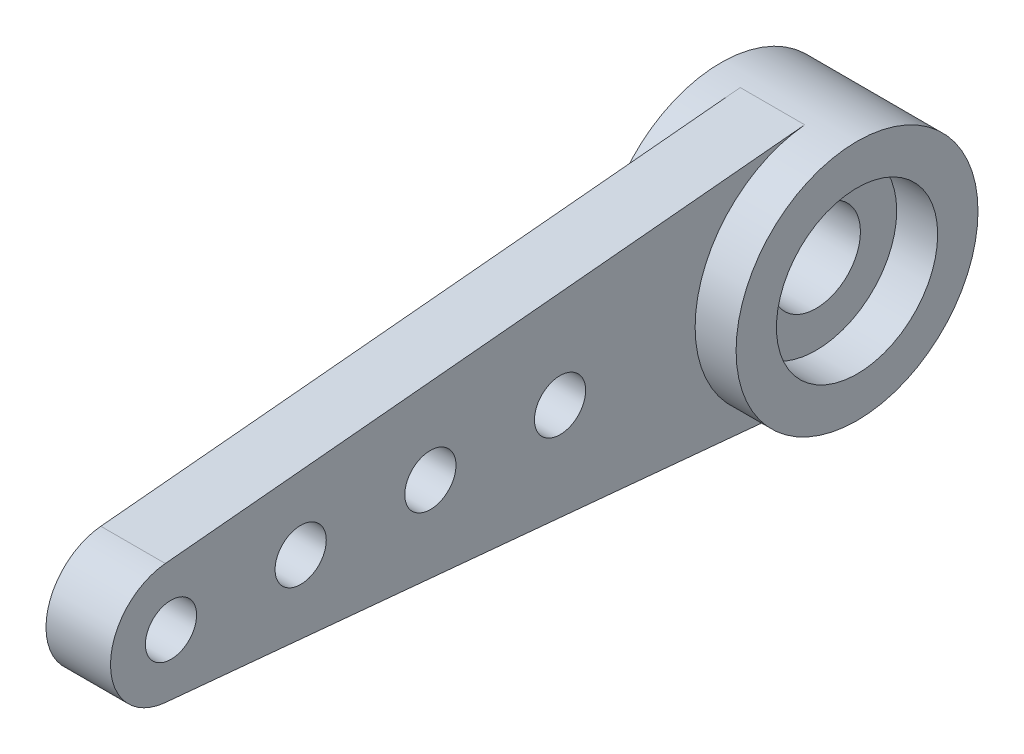
ISO-10303-21;
HEADER;
FILE_DESCRIPTION(('STEP AP214'),'2;1');
FILE_NAME('part.step','',(''),(''),'','','');
FILE_SCHEMA(('AUTOMOTIVE_DESIGN { 1 0 10303 214 1 1 1 1 }'));
ENDSEC;
DATA;
#1=APPLICATION_CONTEXT('core data for automotive mechanical design processes');
#2=APPLICATION_PROTOCOL_DEFINITION('international standard','automotive_design',2000,#1);
#3=PRODUCT_CONTEXT('',#1,'mechanical');
#4=PRODUCT('Part','Part','',(#3));
#5=PRODUCT_RELATED_PRODUCT_CATEGORY('part','',(#4));
#6=PRODUCT_DEFINITION_FORMATION('','',#4);
#7=PRODUCT_DEFINITION_CONTEXT('part definition',#1,'design');
#8=PRODUCT_DEFINITION('design','',#6,#7);
#9=PRODUCT_DEFINITION_SHAPE('','',#8);
#10=(LENGTH_UNIT() NAMED_UNIT(*) SI_UNIT(.MILLI.,.METRE.));
#11=(NAMED_UNIT(*) PLANE_ANGLE_UNIT() SI_UNIT($,.RADIAN.));
#12=(NAMED_UNIT(*) SI_UNIT($,.STERADIAN.) SOLID_ANGLE_UNIT());
#13=UNCERTAINTY_MEASURE_WITH_UNIT(LENGTH_MEASURE(1.E-05),#10,'distance_accuracy_value','');
#14=(GEOMETRIC_REPRESENTATION_CONTEXT(3) GLOBAL_UNCERTAINTY_ASSIGNED_CONTEXT((#13)) GLOBAL_UNIT_ASSIGNED_CONTEXT((#10,
#11,#12)) REPRESENTATION_CONTEXT('',''));
#15=CARTESIAN_POINT('',(0.,0.,0.));
#16=DIRECTION('',(0.,0.,1.));
#17=DIRECTION('',(1.,0.,0.));
#18=AXIS2_PLACEMENT_3D('',#15,#16,#17);
#19=CARTESIAN_POINT('',(0.,0.,0.));
#20=DIRECTION('',(1.,0.,0.));
#21=DIRECTION('',(0.,0.,-1.));
#22=AXIS2_PLACEMENT_3D('',#19,#20,#21);
#23=PLANE('',#22);
#24=CARTESIAN_POINT('',(0.,0.,0.));
#25=DIRECTION('',(1.,0.,0.));
#26=DIRECTION('',(0.,0.,-1.));
#27=AXIS2_PLACEMENT_3D('',#24,#25,#26);
#28=CIRCLE('',#27,1.1);
#29=CARTESIAN_POINT('',(0.,0.,-1.1));
#30=VERTEX_POINT('',#29);
#31=EDGE_CURVE('E259',#30,#30,#28,.T.);
#32=ORIENTED_EDGE('',*,*,#31,.T.);
#33=EDGE_LOOP('',(#32));
#34=FACE_BOUND('',#33,.T.);
#35=CARTESIAN_POINT('',(0.,0.,0.));
#36=DIRECTION('',(-1.,0.,0.));
#37=DIRECTION('',(0.,0.,1.));
#38=AXIS2_PLACEMENT_3D('',#35,#36,#37);
#39=CIRCLE('',#38,2.);
#40=CARTESIAN_POINT('',(0.,0.,-2.));
#41=VERTEX_POINT('',#40);
#42=EDGE_CURVE('E206',#41,#41,#39,.T.);
#43=ORIENTED_EDGE('',*,*,#42,.T.);
#44=EDGE_LOOP('',(#43));
#45=FACE_BOUND('',#44,.T.);
#46=ADVANCED_FACE('F47',(#34,#45),#23,.F.);
#47=CARTESIAN_POINT('',(1.6,0.,0.));
#48=DIRECTION('',(1.,0.,0.));
#49=DIRECTION('',(0.,0.,-1.));
#50=AXIS2_PLACEMENT_3D('',#47,#48,#49);
#51=PLANE('',#50);
#52=CARTESIAN_POINT('',(1.6,0.,0.));
#53=DIRECTION('',(1.,0.,0.));
#54=DIRECTION('',(0.,0.,-1.));
#55=AXIS2_PLACEMENT_3D('',#52,#53,#54);
#56=CIRCLE('',#55,1.1);
#57=CARTESIAN_POINT('',(1.6,0.,-1.1));
#58=VERTEX_POINT('',#57);
#59=EDGE_CURVE('E107',#58,#58,#56,.T.);
#60=ORIENTED_EDGE('',*,*,#59,.F.);
#61=EDGE_LOOP('',(#60));
#62=FACE_BOUND('',#61,.T.);
#63=CARTESIAN_POINT('',(1.6,0.,0.));
#64=DIRECTION('',(1.,0.,0.));
#65=DIRECTION('',(0.,0.,-1.));
#66=AXIS2_PLACEMENT_3D('',#63,#64,#65);
#67=CIRCLE('',#66,2.);
#68=CARTESIAN_POINT('',(1.6,0.,-2.));
#69=VERTEX_POINT('',#68);
#70=EDGE_CURVE('E215',#69,#69,#67,.T.);
#71=ORIENTED_EDGE('',*,*,#70,.T.);
#72=EDGE_LOOP('',(#71));
#73=FACE_BOUND('',#72,.T.);
#74=ADVANCED_FACE('F151',(#62,#73),#51,.T.);
#75=CARTESIAN_POINT('',(1.6,0.,0.));
#76=DIRECTION('',(1.,0.,0.));
#77=DIRECTION('',(0.,0.,-1.));
#78=AXIS2_PLACEMENT_3D('',#75,#76,#77);
#79=CIRCLE('',#78,3.);
#80=CARTESIAN_POINT('',(1.6,2.98678731038887,0.28125));
#81=VERTEX_POINT('',#80);
#82=CARTESIAN_POINT('',(1.6,-2.98678731038887,0.28125));
#83=VERTEX_POINT('',#82);
#84=EDGE_CURVE('E112',#81,#83,#79,.T.);
#85=ORIENTED_EDGE('',*,*,#84,.F.);
#86=DIRECTION('',(0.,-0.09375,0.995595770129625));
#87=VECTOR('',#86,1.);
#88=CARTESIAN_POINT('',(1.6,2.98678731038887,0.28125));
#89=LINE('',#88,#87);
#90=CARTESIAN_POINT('',(1.6,1.49339365519444,16.140625));
#91=VERTEX_POINT('',#90);
#92=EDGE_CURVE('E90',#81,#91,#89,.T.);
#93=ORIENTED_EDGE('',*,*,#92,.T.);
#94=CARTESIAN_POINT('',(1.6,0.,16.));
#95=DIRECTION('',(1.,0.,0.));
#96=DIRECTION('',(0.,0.,1.));
#97=AXIS2_PLACEMENT_3D('',#94,#95,#96);
#98=CIRCLE('',#97,1.5);
#99=CARTESIAN_POINT('',(1.6,-1.49339365519444,16.140625));
#100=VERTEX_POINT('',#99);
#101=EDGE_CURVE('E120',#91,#100,#98,.T.);
#102=ORIENTED_EDGE('',*,*,#101,.T.);
#103=DIRECTION('',(0.,-0.09375,-0.995595770129625));
#104=VECTOR('',#103,1.);
#105=CARTESIAN_POINT('',(1.6,-2.98678731038887,0.28125));
#106=LINE('',#105,#104);
#107=EDGE_CURVE('E66',#100,#83,#106,.T.);
#108=ORIENTED_EDGE('',*,*,#107,.T.);
#109=EDGE_LOOP('',(#85,#93,#102,#108));
#110=FACE_BOUND('',#109,.T.);
#111=CARTESIAN_POINT('',(1.6,0.,9.56666666666667));
#112=DIRECTION('',(1.,0.,0.));
#113=DIRECTION('',(0.,0.,-1.));
#114=AXIS2_PLACEMENT_3D('',#111,#112,#113);
#115=CIRCLE('',#114,0.635);
#116=CARTESIAN_POINT('',(1.6,0.,8.93166666666667));
#117=VERTEX_POINT('',#116);
#118=EDGE_CURVE('E239',#117,#117,#115,.T.);
#119=ORIENTED_EDGE('',*,*,#118,.F.);
#120=EDGE_LOOP('',(#119));
#121=FACE_BOUND('',#120,.T.);
#122=CARTESIAN_POINT('',(1.6,0.,16.));
#123=DIRECTION('',(1.,0.,0.));
#124=DIRECTION('',(0.,0.,-1.));
#125=AXIS2_PLACEMENT_3D('',#122,#123,#124);
#126=CIRCLE('',#125,0.635);
#127=CARTESIAN_POINT('',(1.6,0.,15.365));
#128=VERTEX_POINT('',#127);
#129=EDGE_CURVE('E255',#128,#128,#126,.T.);
#130=ORIENTED_EDGE('',*,*,#129,.F.);
#131=EDGE_LOOP('',(#130));
#132=FACE_BOUND('',#131,.T.);
#133=CARTESIAN_POINT('',(1.6,0.,12.7833333333333));
#134=DIRECTION('',(1.,0.,0.));
#135=DIRECTION('',(0.,0.,-1.));
#136=AXIS2_PLACEMENT_3D('',#133,#134,#135);
#137=CIRCLE('',#136,0.635);
#138=CARTESIAN_POINT('',(1.6,0.,12.1483333333333));
#139=VERTEX_POINT('',#138);
#140=EDGE_CURVE('E247',#139,#139,#137,.T.);
#141=ORIENTED_EDGE('',*,*,#140,.F.);
#142=EDGE_LOOP('',(#141));
#143=FACE_BOUND('',#142,.T.);
#144=CARTESIAN_POINT('',(1.6,0.,6.35));
#145=DIRECTION('',(1.,0.,0.));
#146=DIRECTION('',(0.,0.,-1.));
#147=AXIS2_PLACEMENT_3D('',#144,#145,#146);
#148=CIRCLE('',#147,0.635);
#149=CARTESIAN_POINT('',(1.6,0.,5.715));
#150=VERTEX_POINT('',#149);
#151=EDGE_CURVE('E231',#150,#150,#148,.T.);
#152=ORIENTED_EDGE('',*,*,#151,.F.);
#153=EDGE_LOOP('',(#152));
#154=FACE_BOUND('',#153,.T.);
#155=ADVANCED_FACE('F158',(#110,#121,#132,#143,#154),#51,.T.);
#156=CARTESIAN_POINT('',(0.,0.,0.));
#157=DIRECTION('',(-1.,0.,0.));
#158=DIRECTION('',(0.,0.,1.));
#159=AXIS2_PLACEMENT_3D('',#156,#157,#158);
#160=CIRCLE('',#159,3.);
#161=CARTESIAN_POINT('',(0.,-2.98678731038887,0.28125));
#162=VERTEX_POINT('',#161);
#163=CARTESIAN_POINT('',(0.,2.98678731038887,0.28125));
#164=VERTEX_POINT('',#163);
#165=EDGE_CURVE('E11',#162,#164,#160,.T.);
#166=ORIENTED_EDGE('',*,*,#165,.F.);
#167=DIRECTION('',(0.,-0.09375,-0.995595770129625));
#168=VECTOR('',#167,1.);
#169=CARTESIAN_POINT('',(0.,-2.98678731038887,0.28125));
#170=LINE('',#169,#168);
#171=CARTESIAN_POINT('',(0.,-1.49339365519444,16.140625));
#172=VERTEX_POINT('',#171);
#173=EDGE_CURVE('E123',#172,#162,#170,.T.);
#174=ORIENTED_EDGE('',*,*,#173,.F.);
#175=CARTESIAN_POINT('',(0.,0.,16.));
#176=DIRECTION('',(1.,0.,0.));
#177=DIRECTION('',(0.,0.,1.));
#178=AXIS2_PLACEMENT_3D('',#175,#176,#177);
#179=CIRCLE('',#178,1.5);
#180=CARTESIAN_POINT('',(0.,1.49339365519444,16.140625));
#181=VERTEX_POINT('',#180);
#182=EDGE_CURVE('E81',#181,#172,#179,.T.);
#183=ORIENTED_EDGE('',*,*,#182,.F.);
#184=DIRECTION('',(0.,-0.09375,0.995595770129625));
#185=VECTOR('',#184,1.);
#186=CARTESIAN_POINT('',(0.,2.98678731038887,0.28125));
#187=LINE('',#186,#185);
#188=EDGE_CURVE('E99',#164,#181,#187,.T.);
#189=ORIENTED_EDGE('',*,*,#188,.F.);
#190=EDGE_LOOP('',(#166,#174,#183,#189));
#191=FACE_BOUND('',#190,.T.);
#192=CARTESIAN_POINT('',(0.,0.,16.));
#193=DIRECTION('',(1.,0.,0.));
#194=DIRECTION('',(0.,0.,-1.));
#195=AXIS2_PLACEMENT_3D('',#192,#193,#194);
#196=CIRCLE('',#195,0.635);
#197=CARTESIAN_POINT('',(0.,0.,15.365));
#198=VERTEX_POINT('',#197);
#199=EDGE_CURVE('E251',#198,#198,#196,.T.);
#200=ORIENTED_EDGE('',*,*,#199,.T.);
#201=EDGE_LOOP('',(#200));
#202=FACE_BOUND('',#201,.T.);
#203=CARTESIAN_POINT('',(0.,0.,12.7833333333333));
#204=DIRECTION('',(1.,0.,0.));
#205=DIRECTION('',(0.,0.,-1.));
#206=AXIS2_PLACEMENT_3D('',#203,#204,#205);
#207=CIRCLE('',#206,0.635);
#208=CARTESIAN_POINT('',(0.,0.,12.1483333333333));
#209=VERTEX_POINT('',#208);
#210=EDGE_CURVE('E243',#209,#209,#207,.T.);
#211=ORIENTED_EDGE('',*,*,#210,.T.);
#212=EDGE_LOOP('',(#211));
#213=FACE_BOUND('',#212,.T.);
#214=CARTESIAN_POINT('',(0.,0.,9.56666666666667));
#215=DIRECTION('',(1.,0.,0.));
#216=DIRECTION('',(0.,0.,-1.));
#217=AXIS2_PLACEMENT_3D('',#214,#215,#216);
#218=CIRCLE('',#217,0.635);
#219=CARTESIAN_POINT('',(0.,0.,8.93166666666667));
#220=VERTEX_POINT('',#219);
#221=EDGE_CURVE('E235',#220,#220,#218,.T.);
#222=ORIENTED_EDGE('',*,*,#221,.T.);
#223=EDGE_LOOP('',(#222));
#224=FACE_BOUND('',#223,.T.);
#225=CARTESIAN_POINT('',(0.,0.,6.35));
#226=DIRECTION('',(1.,0.,0.));
#227=DIRECTION('',(0.,0.,-1.));
#228=AXIS2_PLACEMENT_3D('',#225,#226,#227);
#229=CIRCLE('',#228,0.635);
#230=CARTESIAN_POINT('',(0.,0.,5.715));
#231=VERTEX_POINT('',#230);
#232=EDGE_CURVE('E228',#231,#231,#229,.T.);
#233=ORIENTED_EDGE('',*,*,#232,.T.);
#234=EDGE_LOOP('',(#233));
#235=FACE_BOUND('',#234,.T.);
#236=ADVANCED_FACE('F104',(#191,#202,#213,#224,#235),#23,.F.);
#237=CARTESIAN_POINT('',(1.6,0.,0.));
#238=DIRECTION('',(-1.,0.,0.));
#239=DIRECTION('',(0.,0.,1.));
#240=AXIS2_PLACEMENT_3D('',#237,#238,#239);
#241=CYLINDRICAL_SURFACE('',#240,3.);
#242=DIRECTION('',(-1.,0.,0.));
#243=VECTOR('',#242,1.);
#244=CARTESIAN_POINT('',(1.6,-2.98678731038887,0.28125));
#245=LINE('',#244,#243);
#246=EDGE_CURVE('E111',#83,#162,#245,.T.);
#247=ORIENTED_EDGE('',*,*,#246,.T.);
#248=ORIENTED_EDGE('',*,*,#165,.T.);
#249=DIRECTION('',(-1.,0.,0.));
#250=VECTOR('',#249,1.);
#251=CARTESIAN_POINT('',(1.6,2.98678731038887,0.28125));
#252=LINE('',#251,#250);
#253=EDGE_CURVE('E51',#81,#164,#252,.T.);
#254=ORIENTED_EDGE('',*,*,#253,.F.);
#255=ORIENTED_EDGE('',*,*,#84,.T.);
#256=EDGE_LOOP('',(#247,#248,#254,#255));
#257=FACE_BOUND('',#256,.T.);
#258=CARTESIAN_POINT('',(2.616,0.,0.));
#259=DIRECTION('',(1.,0.,0.));
#260=DIRECTION('',(0.,0.,-1.));
#261=AXIS2_PLACEMENT_3D('',#258,#259,#260);
#262=CIRCLE('',#261,3.);
#263=CARTESIAN_POINT('',(2.616,0.,-3.));
#264=VERTEX_POINT('',#263);
#265=EDGE_CURVE('E224',#264,#264,#262,.T.);
#266=ORIENTED_EDGE('',*,*,#265,.F.);
#267=EDGE_LOOP('',(#266));
#268=FACE_BOUND('',#267,.T.);
#269=CARTESIAN_POINT('',(-0.762,0.,0.));
#270=DIRECTION('',(-1.,0.,0.));
#271=DIRECTION('',(0.,0.,1.));
#272=AXIS2_PLACEMENT_3D('',#269,#270,#271);
#273=CIRCLE('',#272,3.);
#274=CARTESIAN_POINT('',(-0.762,0.,3.));
#275=VERTEX_POINT('',#274);
#276=EDGE_CURVE('E210',#275,#275,#273,.T.);
#277=ORIENTED_EDGE('',*,*,#276,.F.);
#278=EDGE_LOOP('',(#277));
#279=FACE_BOUND('',#278,.T.);
#280=ADVANCED_FACE('F49',(#257,#268,#279),#241,.T.);
#281=CARTESIAN_POINT('',(1.6,2.98678731038887,0.28125));
#282=DIRECTION('',(0.,-0.995595770129624,-0.09375));
#283=DIRECTION('',(0.,0.09375,-0.995595770129625));
#284=AXIS2_PLACEMENT_3D('',#281,#282,#283);
#285=PLANE('',#284);
#286=ORIENTED_EDGE('',*,*,#188,.T.);
#287=DIRECTION('',(-1.,0.,0.));
#288=VECTOR('',#287,1.);
#289=CARTESIAN_POINT('',(1.6,1.49339365519444,16.140625));
#290=LINE('',#289,#288);
#291=EDGE_CURVE('E103',#91,#181,#290,.T.);
#292=ORIENTED_EDGE('',*,*,#291,.F.);
#293=ORIENTED_EDGE('',*,*,#92,.F.);
#294=ORIENTED_EDGE('',*,*,#253,.T.);
#295=EDGE_LOOP('',(#286,#292,#293,#294));
#296=FACE_BOUND('',#295,.T.);
#297=ADVANCED_FACE('F98',(#296),#285,.F.);
#298=CARTESIAN_POINT('',(1.6,0.,16.));
#299=DIRECTION('',(-1.,0.,0.));
#300=DIRECTION('',(0.,0.,1.));
#301=AXIS2_PLACEMENT_3D('',#298,#299,#300);
#302=CYLINDRICAL_SURFACE('',#301,1.5);
#303=ORIENTED_EDGE('',*,*,#182,.T.);
#304=DIRECTION('',(-1.,0.,0.));
#305=VECTOR('',#304,1.);
#306=CARTESIAN_POINT('',(1.6,-1.49339365519444,16.140625));
#307=LINE('',#306,#305);
#308=EDGE_CURVE('E115',#100,#172,#307,.T.);
#309=ORIENTED_EDGE('',*,*,#308,.F.);
#310=ORIENTED_EDGE('',*,*,#101,.F.);
#311=ORIENTED_EDGE('',*,*,#291,.T.);
#312=EDGE_LOOP('',(#303,#309,#310,#311));
#313=FACE_BOUND('',#312,.T.);
#314=ADVANCED_FACE('F127',(#313),#302,.T.);
#315=CARTESIAN_POINT('',(1.6,-2.98678731038887,0.28125));
#316=DIRECTION('',(0.,0.995595770129624,-0.09375));
#317=DIRECTION('',(0.,0.09375,0.995595770129625));
#318=AXIS2_PLACEMENT_3D('',#315,#316,#317);
#319=PLANE('',#318);
#320=ORIENTED_EDGE('',*,*,#173,.T.);
#321=ORIENTED_EDGE('',*,*,#246,.F.);
#322=ORIENTED_EDGE('',*,*,#107,.F.);
#323=ORIENTED_EDGE('',*,*,#308,.T.);
#324=EDGE_LOOP('',(#320,#321,#322,#323));
#325=FACE_BOUND('',#324,.T.);
#326=ADVANCED_FACE('F135',(#325),#319,.F.);
#327=CARTESIAN_POINT('',(1.6,0.,0.));
#328=DIRECTION('',(-1.,0.,0.));
#329=DIRECTION('',(0.,0.,1.));
#330=AXIS2_PLACEMENT_3D('',#327,#328,#329);
#331=CYLINDRICAL_SURFACE('',#330,1.1);
#332=ORIENTED_EDGE('',*,*,#59,.T.);
#333=EDGE_LOOP('',(#332));
#334=FACE_BOUND('',#333,.T.);
#335=ORIENTED_EDGE('',*,*,#31,.F.);
#336=EDGE_LOOP('',(#335));
#337=FACE_BOUND('',#336,.T.);
#338=ADVANCED_FACE('F137',(#334,#337),#331,.F.);
#339=CARTESIAN_POINT('',(1.6,0.,16.));
#340=DIRECTION('',(-1.,0.,0.));
#341=DIRECTION('',(0.,0.,1.));
#342=AXIS2_PLACEMENT_3D('',#339,#340,#341);
#343=CYLINDRICAL_SURFACE('',#342,0.635);
#344=ORIENTED_EDGE('',*,*,#129,.T.);
#345=EDGE_LOOP('',(#344));
#346=FACE_BOUND('',#345,.T.);
#347=ORIENTED_EDGE('',*,*,#199,.F.);
#348=EDGE_LOOP('',(#347));
#349=FACE_BOUND('',#348,.T.);
#350=ADVANCED_FACE('F144',(#346,#349),#343,.F.);
#351=CARTESIAN_POINT('',(1.6,0.,12.7833333333333));
#352=DIRECTION('',(-1.,0.,0.));
#353=DIRECTION('',(0.,0.,1.));
#354=AXIS2_PLACEMENT_3D('',#351,#352,#353);
#355=CYLINDRICAL_SURFACE('',#354,0.635);
#356=ORIENTED_EDGE('',*,*,#140,.T.);
#357=EDGE_LOOP('',(#356));
#358=FACE_BOUND('',#357,.T.);
#359=ORIENTED_EDGE('',*,*,#210,.F.);
#360=EDGE_LOOP('',(#359));
#361=FACE_BOUND('',#360,.T.);
#362=ADVANCED_FACE('F173',(#358,#361),#355,.F.);
#363=CARTESIAN_POINT('',(1.6,0.,9.56666666666667));
#364=DIRECTION('',(-1.,0.,0.));
#365=DIRECTION('',(0.,0.,1.));
#366=AXIS2_PLACEMENT_3D('',#363,#364,#365);
#367=CYLINDRICAL_SURFACE('',#366,0.635);
#368=ORIENTED_EDGE('',*,*,#118,.T.);
#369=EDGE_LOOP('',(#368));
#370=FACE_BOUND('',#369,.T.);
#371=ORIENTED_EDGE('',*,*,#221,.F.);
#372=EDGE_LOOP('',(#371));
#373=FACE_BOUND('',#372,.T.);
#374=ADVANCED_FACE('F177',(#370,#373),#367,.F.);
#375=CARTESIAN_POINT('',(1.6,0.,6.35));
#376=DIRECTION('',(-1.,0.,0.));
#377=DIRECTION('',(0.,0.,1.));
#378=AXIS2_PLACEMENT_3D('',#375,#376,#377);
#379=CYLINDRICAL_SURFACE('',#378,0.635);
#380=ORIENTED_EDGE('',*,*,#151,.T.);
#381=EDGE_LOOP('',(#380));
#382=FACE_BOUND('',#381,.T.);
#383=ORIENTED_EDGE('',*,*,#232,.F.);
#384=EDGE_LOOP('',(#383));
#385=FACE_BOUND('',#384,.T.);
#386=ADVANCED_FACE('F181',(#382,#385),#379,.F.);
#387=CARTESIAN_POINT('',(2.616,0.,0.));
#388=DIRECTION('',(1.,0.,0.));
#389=DIRECTION('',(0.,0.,-1.));
#390=AXIS2_PLACEMENT_3D('',#387,#388,#389);
#391=PLANE('',#390);
#392=ORIENTED_EDGE('',*,*,#265,.T.);
#393=EDGE_LOOP('',(#392));
#394=FACE_BOUND('',#393,.T.);
#395=CARTESIAN_POINT('',(2.616,0.,0.));
#396=DIRECTION('',(1.,0.,0.));
#397=DIRECTION('',(0.,0.,-1.));
#398=AXIS2_PLACEMENT_3D('',#395,#396,#397);
#399=CIRCLE('',#398,2.);
#400=CARTESIAN_POINT('',(2.616,0.,-2.));
#401=VERTEX_POINT('',#400);
#402=EDGE_CURVE('E217',#401,#401,#399,.T.);
#403=ORIENTED_EDGE('',*,*,#402,.F.);
#404=EDGE_LOOP('',(#403));
#405=FACE_BOUND('',#404,.T.);
#406=ADVANCED_FACE('F185',(#394,#405),#391,.T.);
#407=CARTESIAN_POINT('',(2.616,0.,0.));
#408=DIRECTION('',(-1.,0.,0.));
#409=DIRECTION('',(0.,0.,1.));
#410=AXIS2_PLACEMENT_3D('',#407,#408,#409);
#411=CYLINDRICAL_SURFACE('',#410,2.);
#412=ORIENTED_EDGE('',*,*,#402,.T.);
#413=EDGE_LOOP('',(#412));
#414=FACE_BOUND('',#413,.T.);
#415=ORIENTED_EDGE('',*,*,#70,.F.);
#416=EDGE_LOOP('',(#415));
#417=FACE_BOUND('',#416,.T.);
#418=ADVANCED_FACE('F188',(#414,#417),#411,.F.);
#419=CARTESIAN_POINT('',(-0.762,0.,0.));
#420=DIRECTION('',(-1.,0.,0.));
#421=DIRECTION('',(0.,0.,1.));
#422=AXIS2_PLACEMENT_3D('',#419,#420,#421);
#423=PLANE('',#422);
#424=ORIENTED_EDGE('',*,*,#276,.T.);
#425=EDGE_LOOP('',(#424));
#426=FACE_BOUND('',#425,.T.);
#427=CARTESIAN_POINT('',(-0.762,0.,0.));
#428=DIRECTION('',(-1.,0.,0.));
#429=DIRECTION('',(0.,0.,1.));
#430=AXIS2_PLACEMENT_3D('',#427,#428,#429);
#431=CIRCLE('',#430,2.);
#432=CARTESIAN_POINT('',(-0.762,0.,-2.));
#433=VERTEX_POINT('',#432);
#434=EDGE_CURVE('E203',#433,#433,#431,.T.);
#435=ORIENTED_EDGE('',*,*,#434,.F.);
#436=EDGE_LOOP('',(#435));
#437=FACE_BOUND('',#436,.T.);
#438=ADVANCED_FACE('F191',(#426,#437),#423,.T.);
#439=CARTESIAN_POINT('',(-0.762,0.,0.));
#440=DIRECTION('',(1.,0.,0.));
#441=DIRECTION('',(0.,0.,-1.));
#442=AXIS2_PLACEMENT_3D('',#439,#440,#441);
#443=CYLINDRICAL_SURFACE('',#442,2.);
#444=CARTESIAN_POINT('',(-0.762,0.,-2.));
#445=CARTESIAN_POINT('',(-0.7540625,0.,-2.));
#446=CARTESIAN_POINT('',(-0.746125,0.,-2.));
#447=CARTESIAN_POINT('',(-0.73025,0.,-2.));
#448=CARTESIAN_POINT('',(-0.7223125,0.,-2.));
#449=CARTESIAN_POINT('',(-0.7064375,0.,-2.));
#450=CARTESIAN_POINT('',(-0.6985,0.,-2.));
#451=CARTESIAN_POINT('',(-0.682625,0.,-2.));
#452=CARTESIAN_POINT('',(-0.6746875,0.,-2.));
#453=CARTESIAN_POINT('',(-0.6588125,0.,-2.));
#454=CARTESIAN_POINT('',(-0.650875,0.,-2.));
#455=CARTESIAN_POINT('',(-0.635,0.,-2.));
#456=CARTESIAN_POINT('',(-0.6270625,0.,-2.));
#457=CARTESIAN_POINT('',(-0.6111875,0.,-2.));
#458=CARTESIAN_POINT('',(-0.60325,0.,-2.));
#459=CARTESIAN_POINT('',(-0.587375,0.,-2.));
#460=CARTESIAN_POINT('',(-0.5794375,0.,-2.));
#461=CARTESIAN_POINT('',(-0.5635625,0.,-2.));
#462=CARTESIAN_POINT('',(-0.555625,0.,-2.));
#463=CARTESIAN_POINT('',(-0.53975,0.,-2.));
#464=CARTESIAN_POINT('',(-0.5318125,0.,-2.));
#465=CARTESIAN_POINT('',(-0.5159375,0.,-2.));
#466=CARTESIAN_POINT('',(-0.508,0.,-2.));
#467=CARTESIAN_POINT('',(-0.492125,0.,-2.));
#468=CARTESIAN_POINT('',(-0.4841875,0.,-2.));
#469=CARTESIAN_POINT('',(-0.4683125,0.,-2.));
#470=CARTESIAN_POINT('',(-0.460375,0.,-2.));
#471=CARTESIAN_POINT('',(-0.4445,0.,-2.));
#472=CARTESIAN_POINT('',(-0.4365625,0.,-2.));
#473=CARTESIAN_POINT('',(-0.4206875,0.,-2.));
#474=CARTESIAN_POINT('',(-0.41275,0.,-2.));
#475=CARTESIAN_POINT('',(-0.396875,0.,-2.));
#476=CARTESIAN_POINT('',(-0.3889375,0.,-2.));
#477=CARTESIAN_POINT('',(-0.3730625,0.,-2.));
#478=CARTESIAN_POINT('',(-0.365125,0.,-2.));
#479=CARTESIAN_POINT('',(-0.34925,0.,-2.));
#480=CARTESIAN_POINT('',(-0.3413125,0.,-2.));
#481=CARTESIAN_POINT('',(-0.3254375,0.,-2.));
#482=CARTESIAN_POINT('',(-0.3175,0.,-2.));
#483=CARTESIAN_POINT('',(-0.301625,0.,-2.));
#484=CARTESIAN_POINT('',(-0.2936875,0.,-2.));
#485=CARTESIAN_POINT('',(-0.2778125,0.,-2.));
#486=CARTESIAN_POINT('',(-0.269875,0.,-2.));
#487=CARTESIAN_POINT('',(-0.254,0.,-2.));
#488=CARTESIAN_POINT('',(-0.2460625,0.,-2.));
#489=CARTESIAN_POINT('',(-0.2301875,0.,-2.));
#490=CARTESIAN_POINT('',(-0.22225,0.,-2.));
#491=CARTESIAN_POINT('',(-0.206375,0.,-2.));
#492=CARTESIAN_POINT('',(-0.1984375,0.,-2.));
#493=CARTESIAN_POINT('',(-0.1825625,0.,-2.));
#494=CARTESIAN_POINT('',(-0.174625,0.,-2.));
#495=CARTESIAN_POINT('',(-0.15875,0.,-2.));
#496=CARTESIAN_POINT('',(-0.1508125,0.,-2.));
#497=CARTESIAN_POINT('',(-0.1349375,0.,-2.));
#498=CARTESIAN_POINT('',(-0.127,0.,-2.));
#499=CARTESIAN_POINT('',(-0.111125,0.,-2.));
#500=CARTESIAN_POINT('',(-0.1031875,0.,-2.));
#501=CARTESIAN_POINT('',(-0.0873125,0.,-2.));
#502=CARTESIAN_POINT('',(-0.079375,0.,-2.));
#503=CARTESIAN_POINT('',(-0.0635,0.,-2.));
#504=CARTESIAN_POINT('',(-0.0555625,0.,-2.));
#505=CARTESIAN_POINT('',(-0.0396875,0.,-2.));
#506=CARTESIAN_POINT('',(-0.03175,0.,-2.));
#507=CARTESIAN_POINT('',(-0.015875,0.,-2.));
#508=CARTESIAN_POINT('',(-0.00793749999999999,0.,-2.));
#509=CARTESIAN_POINT('',(0.,0.,-2.));
#510=B_SPLINE_CURVE_WITH_KNOTS('',3,(#444,#445,#446,#447,#448,#449,#450,#451,#452,#453,#454,
#455,#456,#457,#458,#459,#460,#461,#462,#463,#464,#465,#466,#467,#468,#469,#470,#471,#472,#473,
#474,#475,#476,#477,#478,#479,#480,#481,#482,#483,#484,#485,#486,#487,#488,#489,#490,#491,#492,
#493,#494,#495,#496,#497,#498,#499,#500,#501,#502,#503,#504,#505,#506,#507,#508,#509),
.UNSPECIFIED.,.F.,.F.,(4,2,2,2,2,2,2,2,2,2,2,2,2,2,2,2,2,2,2,2,2,2,2,2,2,2,2,2,2,2,2,2,4),(0.,
0.0238125000000001,0.047625,0.0714375,0.0952500000000001,0.1190625,0.142875,0.1666875,0.1905,
0.2143125,0.238125,0.2619375,0.28575,0.3095625,0.333375,0.3571875,0.381,0.4048125,0.428625,
0.4524375,0.47625,0.5000625,0.523875,0.5476875,0.5715,0.5953125,0.619125,0.6429375,0.66675,
0.6905625,0.714375,0.7381875,0.762),.UNSPECIFIED.);
#511=EDGE_CURVE('BSEAM194',#433,#41,#510,.T.);
#512=ORIENTED_EDGE('',*,*,#434,.T.);
#513=ORIENTED_EDGE('',*,*,#42,.F.);
#514=ORIENTED_EDGE('',*,*,#511,.T.);
#515=ORIENTED_EDGE('',*,*,#511,.F.);
#516=EDGE_LOOP('',(#512,#514,#513,#515));
#517=FACE_BOUND('',#516,.T.);
#518=ADVANCED_FACE('F194',(#517),#443,.F.);
#519=CLOSED_SHELL('',(#46,#74,#155,#236,#280,#297,#314,#326,#338,#350,#362,#374,#386,#406,#418,
#438,#518));
#520=MANIFOLD_SOLID_BREP('B2',#519);
#521=ADVANCED_BREP_SHAPE_REPRESENTATION('',(#18,#520),#14);
#522=SHAPE_DEFINITION_REPRESENTATION(#9,#521);
ENDSEC;
END-ISO-10303-21;
